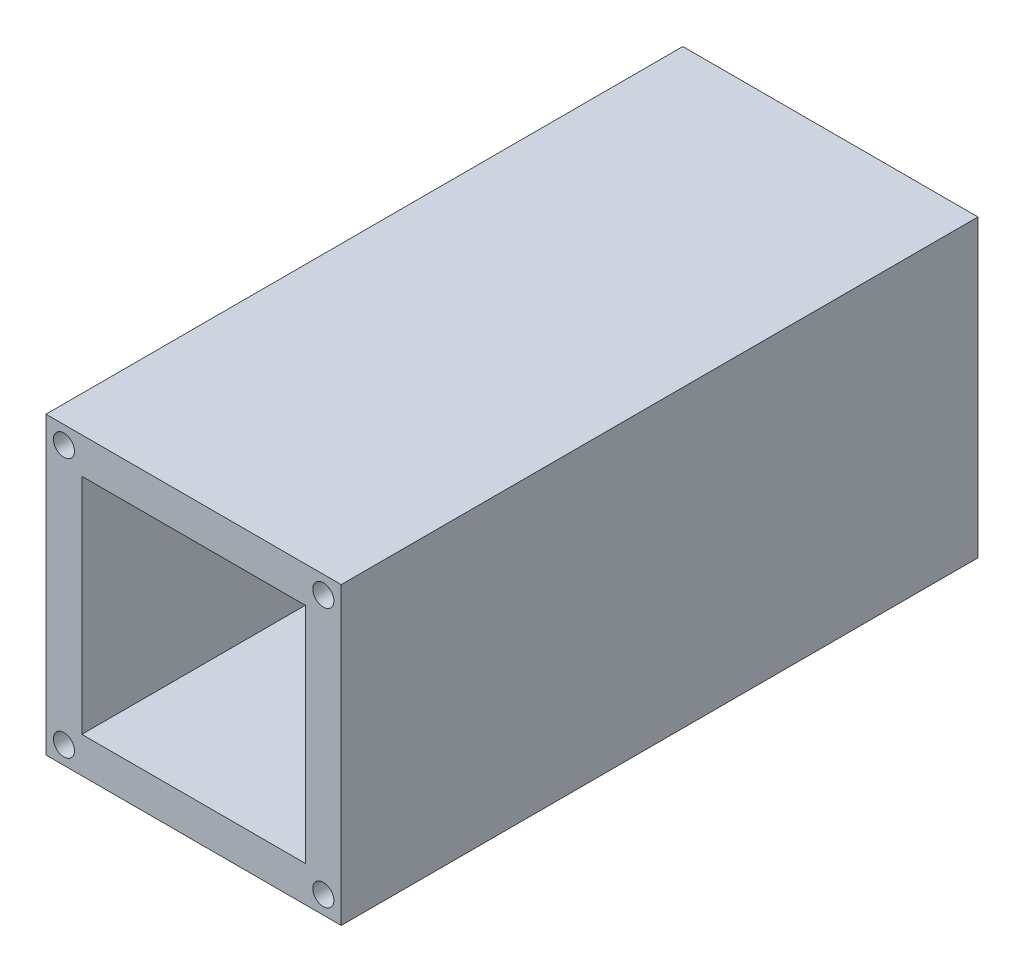
ISO-10303-21;
HEADER;
FILE_DESCRIPTION(('STEP AP214'),'2;1');
FILE_NAME('part.step','',(''),(''),'','','');
FILE_SCHEMA(('AUTOMOTIVE_DESIGN { 1 0 10303 214 1 1 1 1 }'));
ENDSEC;
DATA;
#1=APPLICATION_CONTEXT('core data for automotive mechanical design processes');
#2=APPLICATION_PROTOCOL_DEFINITION('international standard','automotive_design',2000,#1);
#3=PRODUCT_CONTEXT('',#1,'mechanical');
#4=PRODUCT('Part','Part','',(#3));
#5=PRODUCT_RELATED_PRODUCT_CATEGORY('part','',(#4));
#6=PRODUCT_DEFINITION_FORMATION('','',#4);
#7=PRODUCT_DEFINITION_CONTEXT('part definition',#1,'design');
#8=PRODUCT_DEFINITION('design','',#6,#7);
#9=PRODUCT_DEFINITION_SHAPE('','',#8);
#10=(LENGTH_UNIT() NAMED_UNIT(*) SI_UNIT(.MILLI.,.METRE.));
#11=(NAMED_UNIT(*) PLANE_ANGLE_UNIT() SI_UNIT($,.RADIAN.));
#12=(NAMED_UNIT(*) SI_UNIT($,.STERADIAN.) SOLID_ANGLE_UNIT());
#13=UNCERTAINTY_MEASURE_WITH_UNIT(LENGTH_MEASURE(1.E-05),#10,'distance_accuracy_value','');
#14=(GEOMETRIC_REPRESENTATION_CONTEXT(3) GLOBAL_UNCERTAINTY_ASSIGNED_CONTEXT((#13)) GLOBAL_UNIT_ASSIGNED_CONTEXT((#10,
#11,#12)) REPRESENTATION_CONTEXT('',''));
#15=CARTESIAN_POINT('',(0.,0.,0.));
#16=DIRECTION('',(0.,0.,1.));
#17=DIRECTION('',(1.,0.,0.));
#18=AXIS2_PLACEMENT_3D('',#15,#16,#17);
#19=CARTESIAN_POINT('',(13.25,5.,10.));
#20=DIRECTION('',(0.659692768975271,0.751535395415106,0.));
#21=DIRECTION('',(-0.751535395415106,0.659692768975271,0.));
#22=AXIS2_PLACEMENT_3D('',#19,#20,#21);
#23=PLANE('',#22);
#24=DIRECTION('',(-0.751535395415106,0.659692768975271,0.));
#25=VECTOR('',#24,1.);
#26=CARTESIAN_POINT('',(13.25,5.,30.));
#27=LINE('',#26,#25);
#28=CARTESIAN_POINT('',(13.25,5.,30.));
#29=VERTEX_POINT('',#28);
#30=CARTESIAN_POINT('',(8.38552563578441,9.27000322608372,30.));
#31=VERTEX_POINT('',#30);
#32=EDGE_CURVE('E212',#29,#31,#27,.T.);
#33=ORIENTED_EDGE('',*,*,#32,.F.);
#34=DIRECTION('',(0.,0.,1.));
#35=VECTOR('',#34,1.);
#36=CARTESIAN_POINT('',(13.25,5.,10.));
#37=LINE('',#36,#35);
#38=CARTESIAN_POINT('',(13.25,5.,37.));
#39=VERTEX_POINT('',#38);
#40=EDGE_CURVE('E236',#29,#39,#37,.T.);
#41=ORIENTED_EDGE('',*,*,#40,.T.);
#42=DIRECTION('',(-0.751535395415106,0.659692768975271,0.));
#43=VECTOR('',#42,1.);
#44=CARTESIAN_POINT('',(13.25,5.,37.));
#45=LINE('',#44,#43);
#46=CARTESIAN_POINT('',(8.38552563578441,9.27000322608372,37.));
#47=VERTEX_POINT('',#46);
#48=EDGE_CURVE('E219',#39,#47,#45,.T.);
#49=ORIENTED_EDGE('',*,*,#48,.T.);
#50=DIRECTION('',(0.,0.,1.));
#51=VECTOR('',#50,1.);
#52=CARTESIAN_POINT('',(8.38552563578441,9.27000322608372,10.));
#53=LINE('',#52,#51);
#54=EDGE_CURVE('E235',#31,#47,#53,.T.);
#55=ORIENTED_EDGE('',*,*,#54,.F.);
#56=EDGE_LOOP('',(#33,#41,#49,#55));
#57=FACE_BOUND('',#56,.T.);
#58=ADVANCED_FACE('F35',(#57),#23,.F.);
#59=CARTESIAN_POINT('',(13.25,-5.,10.));
#60=DIRECTION('',(0.659692768975271,-0.751535395415106,0.));
#61=DIRECTION('',(0.751535395415106,0.659692768975271,0.));
#62=AXIS2_PLACEMENT_3D('',#59,#60,#61);
#63=PLANE('',#62);
#64=DIRECTION('',(0.751535395415106,0.659692768975271,0.));
#65=VECTOR('',#64,1.);
#66=CARTESIAN_POINT('',(13.25,-5.,30.));
#67=LINE('',#66,#65);
#68=CARTESIAN_POINT('',(8.38552563578441,-9.27000322608372,30.));
#69=VERTEX_POINT('',#68);
#70=CARTESIAN_POINT('',(13.25,-5.,30.));
#71=VERTEX_POINT('',#70);
#72=EDGE_CURVE('E192',#69,#71,#67,.T.);
#73=ORIENTED_EDGE('',*,*,#72,.F.);
#74=DIRECTION('',(0.,0.,1.));
#75=VECTOR('',#74,1.);
#76=CARTESIAN_POINT('',(8.38552563578441,-9.27000322608372,10.));
#77=LINE('',#76,#75);
#78=CARTESIAN_POINT('',(8.38552563578441,-9.27000322608372,37.));
#79=VERTEX_POINT('',#78);
#80=EDGE_CURVE('E50',#69,#79,#77,.T.);
#81=ORIENTED_EDGE('',*,*,#80,.T.);
#82=DIRECTION('',(0.751535395415106,0.659692768975271,0.));
#83=VECTOR('',#82,1.);
#84=CARTESIAN_POINT('',(13.25,-5.,37.));
#85=LINE('',#84,#83);
#86=CARTESIAN_POINT('',(13.25,-5.,37.));
#87=VERTEX_POINT('',#86);
#88=EDGE_CURVE('E233',#79,#87,#85,.T.);
#89=ORIENTED_EDGE('',*,*,#88,.T.);
#90=DIRECTION('',(0.,0.,1.));
#91=VECTOR('',#90,1.);
#92=CARTESIAN_POINT('',(13.25,-5.,10.));
#93=LINE('',#92,#91);
#94=EDGE_CURVE('E238',#71,#87,#93,.T.);
#95=ORIENTED_EDGE('',*,*,#94,.F.);
#96=EDGE_LOOP('',(#73,#81,#89,#95));
#97=FACE_BOUND('',#96,.T.);
#98=ADVANCED_FACE('F385',(#97),#63,.F.);
#99=CARTESIAN_POINT('',(0.,0.282957820074073,10.));
#100=DIRECTION('',(0.,0.,1.));
#101=DIRECTION('',(1.,0.,0.));
#102=AXIS2_PLACEMENT_3D('',#99,#100,#101);
#103=CYLINDRICAL_SURFACE('',#102,12.711258983193);
#104=CARTESIAN_POINT('',(0.,0.282957820074073,30.));
#105=DIRECTION('',(0.,0.,-1.));
#106=DIRECTION('',(-1.,0.,0.));
#107=AXIS2_PLACEMENT_3D('',#104,#105,#106);
#108=CIRCLE('',#107,12.711258983193);
#109=CARTESIAN_POINT('',(-8.3855256357844,-9.27000322608372,30.));
#110=VERTEX_POINT('',#109);
#111=EDGE_CURVE('E216',#110,#69,#108,.F.);
#112=ORIENTED_EDGE('',*,*,#111,.F.);
#113=DIRECTION('',(0.,0.,1.));
#114=VECTOR('',#113,1.);
#115=CARTESIAN_POINT('',(-8.3855256357844,-9.27000322608372,10.));
#116=LINE('',#115,#114);
#117=CARTESIAN_POINT('',(-8.3855256357844,-9.27000322608372,37.));
#118=VERTEX_POINT('',#117);
#119=EDGE_CURVE('E241',#110,#118,#116,.T.);
#120=ORIENTED_EDGE('',*,*,#119,.T.);
#121=CARTESIAN_POINT('',(0.,0.282957820074073,37.));
#122=DIRECTION('',(0.,0.,1.));
#123=DIRECTION('',(-1.,0.,0.));
#124=AXIS2_PLACEMENT_3D('',#121,#122,#123);
#125=CIRCLE('',#124,12.711258983193);
#126=EDGE_CURVE('E231',#118,#79,#125,.T.);
#127=ORIENTED_EDGE('',*,*,#126,.T.);
#128=ORIENTED_EDGE('',*,*,#80,.F.);
#129=EDGE_LOOP('',(#112,#120,#127,#128));
#130=FACE_BOUND('',#129,.T.);
#131=ADVANCED_FACE('F389',(#130),#103,.F.);
#132=CARTESIAN_POINT('',(-13.25,-5.00000000000001,10.));
#133=DIRECTION('',(-0.659692768975271,-0.751535395415106,0.));
#134=DIRECTION('',(0.751535395415106,-0.659692768975271,0.));
#135=AXIS2_PLACEMENT_3D('',#132,#133,#134);
#136=PLANE('',#135);
#137=DIRECTION('',(0.751535395415106,-0.659692768975271,0.));
#138=VECTOR('',#137,1.);
#139=CARTESIAN_POINT('',(-13.25,-5.00000000000001,30.));
#140=LINE('',#139,#138);
#141=CARTESIAN_POINT('',(-13.25,-5.00000000000001,30.));
#142=VERTEX_POINT('',#141);
#143=EDGE_CURVE('E214',#142,#110,#140,.T.);
#144=ORIENTED_EDGE('',*,*,#143,.F.);
#145=DIRECTION('',(0.,0.,1.));
#146=VECTOR('',#145,1.);
#147=CARTESIAN_POINT('',(-13.25,-5.00000000000001,10.));
#148=LINE('',#147,#146);
#149=CARTESIAN_POINT('',(-13.25,-5.00000000000001,37.));
#150=VERTEX_POINT('',#149);
#151=EDGE_CURVE('E243',#142,#150,#148,.T.);
#152=ORIENTED_EDGE('',*,*,#151,.T.);
#153=DIRECTION('',(0.751535395415106,-0.659692768975271,0.));
#154=VECTOR('',#153,1.);
#155=CARTESIAN_POINT('',(-13.25,-5.00000000000001,37.));
#156=LINE('',#155,#154);
#157=EDGE_CURVE('E228',#150,#118,#156,.T.);
#158=ORIENTED_EDGE('',*,*,#157,.T.);
#159=ORIENTED_EDGE('',*,*,#119,.F.);
#160=EDGE_LOOP('',(#144,#152,#158,#159));
#161=FACE_BOUND('',#160,.T.);
#162=ADVANCED_FACE('F393',(#161),#136,.F.);
#163=CARTESIAN_POINT('',(-13.25,5.,10.));
#164=DIRECTION('',(-0.659692768975271,0.751535395415106,0.));
#165=DIRECTION('',(-0.751535395415106,-0.659692768975271,0.));
#166=AXIS2_PLACEMENT_3D('',#163,#164,#165);
#167=PLANE('',#166);
#168=DIRECTION('',(-0.751535395415106,-0.659692768975271,0.));
#169=VECTOR('',#168,1.);
#170=CARTESIAN_POINT('',(-13.25,5.,30.));
#171=LINE('',#170,#169);
#172=CARTESIAN_POINT('',(-8.3855256357844,9.27000322608372,30.));
#173=VERTEX_POINT('',#172);
#174=CARTESIAN_POINT('',(-13.25,5.,30.));
#175=VERTEX_POINT('',#174);
#176=EDGE_CURVE('E210',#173,#175,#171,.T.);
#177=ORIENTED_EDGE('',*,*,#176,.F.);
#178=DIRECTION('',(0.,0.,1.));
#179=VECTOR('',#178,1.);
#180=CARTESIAN_POINT('',(-8.38552563578441,9.27000322608372,10.));
#181=LINE('',#180,#179);
#182=CARTESIAN_POINT('',(-8.38552563578441,9.27000322608372,37.));
#183=VERTEX_POINT('',#182);
#184=EDGE_CURVE('E247',#173,#183,#181,.T.);
#185=ORIENTED_EDGE('',*,*,#184,.T.);
#186=DIRECTION('',(-0.751535395415106,-0.659692768975271,0.));
#187=VECTOR('',#186,1.);
#188=CARTESIAN_POINT('',(-13.25,5.,37.));
#189=LINE('',#188,#187);
#190=CARTESIAN_POINT('',(-13.25,5.,37.));
#191=VERTEX_POINT('',#190);
#192=EDGE_CURVE('E225',#183,#191,#189,.T.);
#193=ORIENTED_EDGE('',*,*,#192,.T.);
#194=DIRECTION('',(0.,0.,1.));
#195=VECTOR('',#194,1.);
#196=CARTESIAN_POINT('',(-13.25,5.,10.));
#197=LINE('',#196,#195);
#198=EDGE_CURVE('E245',#175,#191,#197,.T.);
#199=ORIENTED_EDGE('',*,*,#198,.F.);
#200=EDGE_LOOP('',(#177,#185,#193,#199));
#201=FACE_BOUND('',#200,.T.);
#202=ADVANCED_FACE('F358',(#201),#167,.F.);
#203=CARTESIAN_POINT('',(0.,-0.282957820074094,10.));
#204=DIRECTION('',(0.,0.,1.));
#205=DIRECTION('',(1.,0.,0.));
#206=AXIS2_PLACEMENT_3D('',#203,#204,#205);
#207=CYLINDRICAL_SURFACE('',#206,12.7112589831931);
#208=CARTESIAN_POINT('',(0.,-0.282957820074094,30.));
#209=DIRECTION('',(0.,0.,-1.));
#210=DIRECTION('',(-1.,0.,0.));
#211=AXIS2_PLACEMENT_3D('',#208,#209,#210);
#212=CIRCLE('',#211,12.7112589831931);
#213=EDGE_CURVE('E11',#31,#173,#212,.F.);
#214=ORIENTED_EDGE('',*,*,#213,.F.);
#215=ORIENTED_EDGE('',*,*,#54,.T.);
#216=CARTESIAN_POINT('',(0.,-0.282957820074094,37.));
#217=DIRECTION('',(0.,0.,1.));
#218=DIRECTION('',(-1.,0.,0.));
#219=AXIS2_PLACEMENT_3D('',#216,#217,#218);
#220=CIRCLE('',#219,12.7112589831931);
#221=EDGE_CURVE('E222',#47,#183,#220,.T.);
#222=ORIENTED_EDGE('',*,*,#221,.T.);
#223=ORIENTED_EDGE('',*,*,#184,.F.);
#224=EDGE_LOOP('',(#214,#215,#222,#223));
#225=FACE_BOUND('',#224,.T.);
#226=ADVANCED_FACE('F400',(#225),#207,.F.);
#227=CARTESIAN_POINT('',(0.,0.,37.));
#228=DIRECTION('',(0.,0.,1.));
#229=DIRECTION('',(1.,0.,0.));
#230=AXIS2_PLACEMENT_3D('',#227,#228,#229);
#231=PLANE('',#230);
#232=ORIENTED_EDGE('',*,*,#48,.F.);
#233=DIRECTION('',(0.,1.,0.));
#234=VECTOR('',#233,1.);
#235=CARTESIAN_POINT('',(13.25,-13.25,37.));
#236=LINE('',#235,#234);
#237=CARTESIAN_POINT('',(13.25,13.25,37.));
#238=VERTEX_POINT('',#237);
#239=EDGE_CURVE('E255',#39,#238,#236,.T.);
#240=ORIENTED_EDGE('',*,*,#239,.T.);
#241=DIRECTION('',(-1.,0.,0.));
#242=VECTOR('',#241,1.);
#243=CARTESIAN_POINT('',(13.25,13.25,37.));
#244=LINE('',#243,#242);
#245=CARTESIAN_POINT('',(-13.25,13.25,37.));
#246=VERTEX_POINT('',#245);
#247=EDGE_CURVE('E259',#238,#246,#244,.T.);
#248=ORIENTED_EDGE('',*,*,#247,.T.);
#249=DIRECTION('',(0.,-1.,0.));
#250=VECTOR('',#249,1.);
#251=CARTESIAN_POINT('',(-13.25,-13.25,37.));
#252=LINE('',#251,#250);
#253=EDGE_CURVE('E250',#246,#191,#252,.T.);
#254=ORIENTED_EDGE('',*,*,#253,.T.);
#255=ORIENTED_EDGE('',*,*,#192,.F.);
#256=ORIENTED_EDGE('',*,*,#221,.F.);
#257=EDGE_LOOP('',(#232,#240,#248,#254,#255,#256));
#258=FACE_BOUND('',#257,.T.);
#259=ADVANCED_FACE('F364',(#258),#231,.T.);
#260=CARTESIAN_POINT('',(13.25,13.25,-4.5));
#261=DIRECTION('',(0.,1.,0.));
#262=DIRECTION('',(-1.,0.,0.));
#263=AXIS2_PLACEMENT_3D('',#260,#261,#262);
#264=PLANE('',#263);
#265=DIRECTION('',(0.,0.,1.));
#266=VECTOR('',#265,1.);
#267=CARTESIAN_POINT('',(13.25,13.25,-4.5));
#268=LINE('',#267,#266);
#269=CARTESIAN_POINT('',(13.25,13.25,0.));
#270=VERTEX_POINT('',#269);
#271=CARTESIAN_POINT('',(13.25,13.25,30.));
#272=VERTEX_POINT('',#271);
#273=EDGE_CURVE('E302',#270,#272,#268,.T.);
#274=ORIENTED_EDGE('',*,*,#273,.T.);
#275=DIRECTION('',(1.,0.,0.));
#276=VECTOR('',#275,1.);
#277=CARTESIAN_POINT('',(-13.25,13.25,30.));
#278=LINE('',#277,#276);
#279=CARTESIAN_POINT('',(-13.25,13.25,30.));
#280=VERTEX_POINT('',#279);
#281=EDGE_CURVE('E207',#280,#272,#278,.T.);
#282=ORIENTED_EDGE('',*,*,#281,.F.);
#283=DIRECTION('',(0.,0.,1.));
#284=VECTOR('',#283,1.);
#285=CARTESIAN_POINT('',(-13.25,13.25,-4.5));
#286=LINE('',#285,#284);
#287=CARTESIAN_POINT('',(-13.25,13.25,0.));
#288=VERTEX_POINT('',#287);
#289=EDGE_CURVE('E298',#288,#280,#286,.T.);
#290=ORIENTED_EDGE('',*,*,#289,.F.);
#291=DIRECTION('',(-1.,0.,0.));
#292=VECTOR('',#291,1.);
#293=CARTESIAN_POINT('',(0.,13.25,0.));
#294=LINE('',#293,#292);
#295=EDGE_CURVE('E337',#270,#288,#294,.T.);
#296=ORIENTED_EDGE('',*,*,#295,.F.);
#297=EDGE_LOOP('',(#274,#282,#290,#296));
#298=FACE_BOUND('',#297,.T.);
#299=ADVANCED_FACE('F349',(#298),#264,.F.);
#300=CARTESIAN_POINT('',(13.25,-13.25,-4.5));
#301=DIRECTION('',(0.,-1.,0.));
#302=DIRECTION('',(1.,0.,0.));
#303=AXIS2_PLACEMENT_3D('',#300,#301,#302);
#304=PLANE('',#303);
#305=DIRECTION('',(0.,0.,1.));
#306=VECTOR('',#305,1.);
#307=CARTESIAN_POINT('',(-13.25,-13.25,-4.5));
#308=LINE('',#307,#306);
#309=CARTESIAN_POINT('',(-13.25,-13.25,0.));
#310=VERTEX_POINT('',#309);
#311=CARTESIAN_POINT('',(-13.25,-13.25,30.));
#312=VERTEX_POINT('',#311);
#313=EDGE_CURVE('E198',#310,#312,#308,.T.);
#314=ORIENTED_EDGE('',*,*,#313,.T.);
#315=DIRECTION('',(-1.,0.,0.));
#316=VECTOR('',#315,1.);
#317=CARTESIAN_POINT('',(-13.25,-13.25,30.));
#318=LINE('',#317,#316);
#319=CARTESIAN_POINT('',(13.25,-13.25,30.));
#320=VERTEX_POINT('',#319);
#321=EDGE_CURVE('E191',#320,#312,#318,.T.);
#322=ORIENTED_EDGE('',*,*,#321,.F.);
#323=DIRECTION('',(0.,0.,1.));
#324=VECTOR('',#323,1.);
#325=CARTESIAN_POINT('',(13.25,-13.25,-4.5));
#326=LINE('',#325,#324);
#327=CARTESIAN_POINT('',(13.25,-13.25,0.));
#328=VERTEX_POINT('',#327);
#329=EDGE_CURVE('E174',#328,#320,#326,.T.);
#330=ORIENTED_EDGE('',*,*,#329,.F.);
#331=DIRECTION('',(1.,0.,0.));
#332=VECTOR('',#331,1.);
#333=CARTESIAN_POINT('',(0.,-13.25,0.));
#334=LINE('',#333,#332);
#335=EDGE_CURVE('E334',#310,#328,#334,.T.);
#336=ORIENTED_EDGE('',*,*,#335,.F.);
#337=EDGE_LOOP('',(#314,#322,#330,#336));
#338=FACE_BOUND('',#337,.T.);
#339=ADVANCED_FACE('F196',(#338),#304,.F.);
#340=CARTESIAN_POINT('',(-17.5,-17.5,75.5));
#341=DIRECTION('',(1.,0.,0.));
#342=DIRECTION('',(0.,0.,-1.));
#343=AXIS2_PLACEMENT_3D('',#340,#341,#342);
#344=PLANE('',#343);
#345=DIRECTION('',(0.,-1.,0.));
#346=VECTOR('',#345,1.);
#347=CARTESIAN_POINT('',(-17.5,-17.5,0.));
#348=LINE('',#347,#346);
#349=CARTESIAN_POINT('',(-17.5,17.5,0.));
#350=VERTEX_POINT('',#349);
#351=CARTESIAN_POINT('',(-17.5,-17.5,0.));
#352=VERTEX_POINT('',#351);
#353=EDGE_CURVE('E300',#350,#352,#348,.T.);
#354=ORIENTED_EDGE('',*,*,#353,.T.);
#355=DIRECTION('',(0.,0.,-1.));
#356=VECTOR('',#355,1.);
#357=CARTESIAN_POINT('',(-17.5,-17.5,75.5));
#358=LINE('',#357,#356);
#359=CARTESIAN_POINT('',(-17.5,-17.5,75.5));
#360=VERTEX_POINT('',#359);
#361=EDGE_CURVE('E331',#360,#352,#358,.T.);
#362=ORIENTED_EDGE('',*,*,#361,.F.);
#363=DIRECTION('',(0.,-1.,0.));
#364=VECTOR('',#363,1.);
#365=CARTESIAN_POINT('',(-17.5,-17.5,75.5));
#366=LINE('',#365,#364);
#367=CARTESIAN_POINT('',(-17.5,17.5,75.5));
#368=VERTEX_POINT('',#367);
#369=EDGE_CURVE('E305',#368,#360,#366,.T.);
#370=ORIENTED_EDGE('',*,*,#369,.F.);
#371=DIRECTION('',(0.,0.,-1.));
#372=VECTOR('',#371,1.);
#373=CARTESIAN_POINT('',(-17.5,17.5,75.5));
#374=LINE('',#373,#372);
#375=EDGE_CURVE('E315',#368,#350,#374,.T.);
#376=ORIENTED_EDGE('',*,*,#375,.T.);
#377=EDGE_LOOP('',(#354,#362,#370,#376));
#378=FACE_BOUND('',#377,.T.);
#379=ADVANCED_FACE('F37',(#378),#344,.F.);
#380=CARTESIAN_POINT('',(17.5,-17.5,75.5));
#381=DIRECTION('',(0.,1.,0.));
#382=DIRECTION('',(-1.,0.,0.));
#383=AXIS2_PLACEMENT_3D('',#380,#381,#382);
#384=PLANE('',#383);
#385=DIRECTION('',(1.,0.,0.));
#386=VECTOR('',#385,1.);
#387=CARTESIAN_POINT('',(17.5,-17.5,0.));
#388=LINE('',#387,#386);
#389=CARTESIAN_POINT('',(17.5,-17.5,0.));
#390=VERTEX_POINT('',#389);
#391=EDGE_CURVE('E318',#352,#390,#388,.T.);
#392=ORIENTED_EDGE('',*,*,#391,.T.);
#393=DIRECTION('',(0.,0.,-1.));
#394=VECTOR('',#393,1.);
#395=CARTESIAN_POINT('',(17.5,-17.5,75.5));
#396=LINE('',#395,#394);
#397=CARTESIAN_POINT('',(17.5,-17.5,75.5));
#398=VERTEX_POINT('',#397);
#399=EDGE_CURVE('E328',#398,#390,#396,.T.);
#400=ORIENTED_EDGE('',*,*,#399,.F.);
#401=DIRECTION('',(1.,0.,0.));
#402=VECTOR('',#401,1.);
#403=CARTESIAN_POINT('',(17.5,-17.5,75.5));
#404=LINE('',#403,#402);
#405=EDGE_CURVE('E308',#360,#398,#404,.T.);
#406=ORIENTED_EDGE('',*,*,#405,.F.);
#407=ORIENTED_EDGE('',*,*,#361,.T.);
#408=EDGE_LOOP('',(#392,#400,#406,#407));
#409=FACE_BOUND('',#408,.T.);
#410=ADVANCED_FACE('F466',(#409),#384,.F.);
#411=CARTESIAN_POINT('',(17.5,-17.5,75.5));
#412=DIRECTION('',(-1.,0.,0.));
#413=DIRECTION('',(0.,-1.,0.));
#414=AXIS2_PLACEMENT_3D('',#411,#412,#413);
#415=PLANE('',#414);
#416=DIRECTION('',(0.,1.,0.));
#417=VECTOR('',#416,1.);
#418=CARTESIAN_POINT('',(17.5,-17.5,0.));
#419=LINE('',#418,#417);
#420=CARTESIAN_POINT('',(17.5,17.5,0.));
#421=VERTEX_POINT('',#420);
#422=EDGE_CURVE('E320',#390,#421,#419,.T.);
#423=ORIENTED_EDGE('',*,*,#422,.T.);
#424=DIRECTION('',(0.,0.,-1.));
#425=VECTOR('',#424,1.);
#426=CARTESIAN_POINT('',(17.5,17.5,75.5));
#427=LINE('',#426,#425);
#428=CARTESIAN_POINT('',(17.5,17.5,75.5));
#429=VERTEX_POINT('',#428);
#430=EDGE_CURVE('E325',#429,#421,#427,.T.);
#431=ORIENTED_EDGE('',*,*,#430,.F.);
#432=DIRECTION('',(0.,1.,0.));
#433=VECTOR('',#432,1.);
#434=CARTESIAN_POINT('',(17.5,-17.5,75.5));
#435=LINE('',#434,#433);
#436=EDGE_CURVE('E311',#398,#429,#435,.T.);
#437=ORIENTED_EDGE('',*,*,#436,.F.);
#438=ORIENTED_EDGE('',*,*,#399,.T.);
#439=EDGE_LOOP('',(#423,#431,#437,#438));
#440=FACE_BOUND('',#439,.T.);
#441=ADVANCED_FACE('F463',(#440),#415,.F.);
#442=CARTESIAN_POINT('',(17.5,17.5,75.5));
#443=DIRECTION('',(0.,-1.,0.));
#444=DIRECTION('',(1.,0.,0.));
#445=AXIS2_PLACEMENT_3D('',#442,#443,#444);
#446=PLANE('',#445);
#447=DIRECTION('',(-1.,0.,0.));
#448=VECTOR('',#447,1.);
#449=CARTESIAN_POINT('',(17.5,17.5,0.));
#450=LINE('',#449,#448);
#451=EDGE_CURVE('E309',#421,#350,#450,.T.);
#452=ORIENTED_EDGE('',*,*,#451,.T.);
#453=ORIENTED_EDGE('',*,*,#375,.F.);
#454=DIRECTION('',(-1.,0.,0.));
#455=VECTOR('',#454,1.);
#456=CARTESIAN_POINT('',(17.5,17.5,75.5));
#457=LINE('',#456,#455);
#458=EDGE_CURVE('E313',#429,#368,#457,.T.);
#459=ORIENTED_EDGE('',*,*,#458,.F.);
#460=ORIENTED_EDGE('',*,*,#430,.T.);
#461=EDGE_LOOP('',(#452,#453,#459,#460));
#462=FACE_BOUND('',#461,.T.);
#463=ADVANCED_FACE('F456',(#462),#446,.F.);
#464=CARTESIAN_POINT('',(0.,0.,75.5));
#465=DIRECTION('',(0.,0.,1.));
#466=DIRECTION('',(1.,0.,0.));
#467=AXIS2_PLACEMENT_3D('',#464,#465,#466);
#468=PLANE('',#467);
#469=CARTESIAN_POINT('',(-15.375,-15.38,75.5));
#470=DIRECTION('',(0.,0.,1.));
#471=DIRECTION('',(1.,0.,0.));
#472=AXIS2_PLACEMENT_3D('',#469,#470,#471);
#473=CIRCLE('',#472,1.25);
#474=CARTESIAN_POINT('',(-14.125,-15.38,75.5));
#475=VERTEX_POINT('',#474);
#476=EDGE_CURVE('E261',#475,#475,#473,.T.);
#477=ORIENTED_EDGE('',*,*,#476,.F.);
#478=EDGE_LOOP('',(#477));
#479=FACE_BOUND('',#478,.T.);
#480=CARTESIAN_POINT('',(15.38,-15.38,75.5));
#481=DIRECTION('',(0.,0.,1.));
#482=DIRECTION('',(1.,0.,0.));
#483=AXIS2_PLACEMENT_3D('',#480,#481,#482);
#484=CIRCLE('',#483,1.25);
#485=CARTESIAN_POINT('',(16.63,-15.38,75.5));
#486=VERTEX_POINT('',#485);
#487=EDGE_CURVE('E272',#486,#486,#484,.T.);
#488=ORIENTED_EDGE('',*,*,#487,.F.);
#489=EDGE_LOOP('',(#488));
#490=FACE_BOUND('',#489,.T.);
#491=CARTESIAN_POINT('',(15.38,15.38,75.5));
#492=DIRECTION('',(0.,0.,1.));
#493=DIRECTION('',(1.,0.,0.));
#494=AXIS2_PLACEMENT_3D('',#491,#492,#493);
#495=CIRCLE('',#494,1.25);
#496=CARTESIAN_POINT('',(16.63,15.38,75.5));
#497=VERTEX_POINT('',#496);
#498=EDGE_CURVE('E266',#497,#497,#495,.T.);
#499=ORIENTED_EDGE('',*,*,#498,.F.);
#500=EDGE_LOOP('',(#499));
#501=FACE_BOUND('',#500,.T.);
#502=CARTESIAN_POINT('',(-15.375,15.38,75.5));
#503=DIRECTION('',(0.,0.,1.));
#504=DIRECTION('',(1.,0.,0.));
#505=AXIS2_PLACEMENT_3D('',#502,#503,#504);
#506=CIRCLE('',#505,1.25);
#507=CARTESIAN_POINT('',(-14.125,15.38,75.5));
#508=VERTEX_POINT('',#507);
#509=EDGE_CURVE('E265',#508,#508,#506,.T.);
#510=ORIENTED_EDGE('',*,*,#509,.F.);
#511=EDGE_LOOP('',(#510));
#512=FACE_BOUND('',#511,.T.);
#513=DIRECTION('',(0.,-1.,0.));
#514=VECTOR('',#513,1.);
#515=CARTESIAN_POINT('',(-13.25,-13.25,75.5));
#516=LINE('',#515,#514);
#517=CARTESIAN_POINT('',(-13.25,13.25,75.5));
#518=VERTEX_POINT('',#517);
#519=CARTESIAN_POINT('',(-13.25,-13.25,75.5));
#520=VERTEX_POINT('',#519);
#521=EDGE_CURVE('E283',#518,#520,#516,.T.);
#522=ORIENTED_EDGE('',*,*,#521,.F.);
#523=DIRECTION('',(-1.,0.,0.));
#524=VECTOR('',#523,1.);
#525=CARTESIAN_POINT('',(13.25,13.25,75.5));
#526=LINE('',#525,#524);
#527=CARTESIAN_POINT('',(13.25,13.25,75.5));
#528=VERTEX_POINT('',#527);
#529=EDGE_CURVE('E294',#528,#518,#526,.T.);
#530=ORIENTED_EDGE('',*,*,#529,.F.);
#531=DIRECTION('',(0.,1.,0.));
#532=VECTOR('',#531,1.);
#533=CARTESIAN_POINT('',(13.25,-13.25,75.5));
#534=LINE('',#533,#532);
#535=CARTESIAN_POINT('',(13.25,-13.25,75.5));
#536=VERTEX_POINT('',#535);
#537=EDGE_CURVE('E291',#536,#528,#534,.T.);
#538=ORIENTED_EDGE('',*,*,#537,.F.);
#539=DIRECTION('',(1.,0.,0.));
#540=VECTOR('',#539,1.);
#541=CARTESIAN_POINT('',(13.25,-13.25,75.5));
#542=LINE('',#541,#540);
#543=EDGE_CURVE('E288',#520,#536,#542,.T.);
#544=ORIENTED_EDGE('',*,*,#543,.F.);
#545=EDGE_LOOP('',(#522,#530,#538,#544));
#546=FACE_BOUND('',#545,.T.);
#547=ORIENTED_EDGE('',*,*,#369,.T.);
#548=ORIENTED_EDGE('',*,*,#405,.T.);
#549=ORIENTED_EDGE('',*,*,#436,.T.);
#550=ORIENTED_EDGE('',*,*,#458,.T.);
#551=EDGE_LOOP('',(#547,#548,#549,#550));
#552=FACE_BOUND('',#551,.T.);
#553=ADVANCED_FACE('F375',(#479,#490,#501,#512,#546,#552),#468,.T.);
#554=CARTESIAN_POINT('',(0.,0.,0.));
#555=DIRECTION('',(0.,0.,1.));
#556=DIRECTION('',(1.,0.,0.));
#557=AXIS2_PLACEMENT_3D('',#554,#555,#556);
#558=PLANE('',#557);
#559=CARTESIAN_POINT('',(15.38,-15.38,0.));
#560=DIRECTION('',(0.,0.,-1.));
#561=DIRECTION('',(-1.,0.,0.));
#562=AXIS2_PLACEMENT_3D('',#559,#560,#561);
#563=CIRCLE('',#562,1.25);
#564=CARTESIAN_POINT('',(14.13,-15.38,0.));
#565=VERTEX_POINT('',#564);
#566=EDGE_CURVE('E751',#565,#565,#563,.T.);
#567=ORIENTED_EDGE('',*,*,#566,.F.);
#568=EDGE_LOOP('',(#567));
#569=FACE_BOUND('',#568,.T.);
#570=CARTESIAN_POINT('',(-15.38,-15.38,0.));
#571=DIRECTION('',(0.,0.,-1.));
#572=DIRECTION('',(-1.,0.,0.));
#573=AXIS2_PLACEMENT_3D('',#570,#571,#572);
#574=CIRCLE('',#573,1.25);
#575=CARTESIAN_POINT('',(-16.63,-15.38,0.));
#576=VERTEX_POINT('',#575);
#577=EDGE_CURVE('E750',#576,#576,#574,.T.);
#578=ORIENTED_EDGE('',*,*,#577,.F.);
#579=EDGE_LOOP('',(#578));
#580=FACE_BOUND('',#579,.T.);
#581=CARTESIAN_POINT('',(-15.38,15.38,0.));
#582=DIRECTION('',(0.,0.,-1.));
#583=DIRECTION('',(-1.,0.,0.));
#584=AXIS2_PLACEMENT_3D('',#581,#582,#583);
#585=CIRCLE('',#584,1.25);
#586=CARTESIAN_POINT('',(-16.63,15.38,0.));
#587=VERTEX_POINT('',#586);
#588=EDGE_CURVE('E767',#587,#587,#585,.T.);
#589=ORIENTED_EDGE('',*,*,#588,.F.);
#590=EDGE_LOOP('',(#589));
#591=FACE_BOUND('',#590,.T.);
#592=CARTESIAN_POINT('',(15.38,15.38,0.));
#593=DIRECTION('',(0.,0.,-1.));
#594=DIRECTION('',(-1.,0.,0.));
#595=AXIS2_PLACEMENT_3D('',#592,#593,#594);
#596=CIRCLE('',#595,1.25);
#597=CARTESIAN_POINT('',(14.13,15.38,0.));
#598=VERTEX_POINT('',#597);
#599=EDGE_CURVE('E761',#598,#598,#596,.T.);
#600=ORIENTED_EDGE('',*,*,#599,.F.);
#601=EDGE_LOOP('',(#600));
#602=FACE_BOUND('',#601,.T.);
#603=ORIENTED_EDGE('',*,*,#295,.T.);
#604=DIRECTION('',(0.,-1.,0.));
#605=VECTOR('',#604,1.);
#606=CARTESIAN_POINT('',(-13.25,0.,0.));
#607=LINE('',#606,#605);
#608=EDGE_CURVE('E43',#288,#310,#607,.T.);
#609=ORIENTED_EDGE('',*,*,#608,.T.);
#610=ORIENTED_EDGE('',*,*,#335,.T.);
#611=DIRECTION('',(0.,1.,0.));
#612=VECTOR('',#611,1.);
#613=CARTESIAN_POINT('',(13.25,0.,0.));
#614=LINE('',#613,#612);
#615=EDGE_CURVE('E181',#328,#270,#614,.T.);
#616=ORIENTED_EDGE('',*,*,#615,.T.);
#617=EDGE_LOOP('',(#603,#609,#610,#616));
#618=FACE_BOUND('',#617,.T.);
#619=ORIENTED_EDGE('',*,*,#353,.F.);
#620=ORIENTED_EDGE('',*,*,#451,.F.);
#621=ORIENTED_EDGE('',*,*,#422,.F.);
#622=ORIENTED_EDGE('',*,*,#391,.F.);
#623=EDGE_LOOP('',(#619,#620,#621,#622));
#624=FACE_BOUND('',#623,.T.);
#625=ADVANCED_FACE('F341',(#569,#580,#591,#602,#618,#624),#558,.F.);
#626=CARTESIAN_POINT('',(-13.25,-13.25,-4.5));
#627=DIRECTION('',(-1.,0.,0.));
#628=DIRECTION('',(0.,0.,1.));
#629=AXIS2_PLACEMENT_3D('',#626,#627,#628);
#630=PLANE('',#629);
#631=DIRECTION('',(0.,1.,0.));
#632=VECTOR('',#631,1.);
#633=CARTESIAN_POINT('',(-13.25,-13.25,30.));
#634=LINE('',#633,#632);
#635=EDGE_CURVE('E200',#175,#280,#634,.T.);
#636=ORIENTED_EDGE('',*,*,#635,.F.);
#637=ORIENTED_EDGE('',*,*,#198,.T.);
#638=ORIENTED_EDGE('',*,*,#253,.F.);
#639=EDGE_CURVE('E301',#246,#518,#286,.T.);
#640=ORIENTED_EDGE('',*,*,#639,.T.);
#641=ORIENTED_EDGE('',*,*,#521,.T.);
#642=CARTESIAN_POINT('',(-13.25,-13.25,37.));
#643=VERTEX_POINT('',#642);
#644=EDGE_CURVE('E297',#643,#520,#308,.T.);
#645=ORIENTED_EDGE('',*,*,#644,.F.);
#646=EDGE_CURVE('E58',#150,#643,#252,.T.);
#647=ORIENTED_EDGE('',*,*,#646,.F.);
#648=ORIENTED_EDGE('',*,*,#151,.F.);
#649=EDGE_CURVE('E203',#312,#142,#634,.T.);
#650=ORIENTED_EDGE('',*,*,#649,.F.);
#651=ORIENTED_EDGE('',*,*,#313,.F.);
#652=ORIENTED_EDGE('',*,*,#608,.F.);
#653=ORIENTED_EDGE('',*,*,#289,.T.);
#654=EDGE_LOOP('',(#636,#637,#638,#640,#641,#645,#647,#648,#650,#651,#652,#653));
#655=FACE_BOUND('',#654,.T.);
#656=ADVANCED_FACE('F346',(#655),#630,.F.);
#657=ORIENTED_EDGE('',*,*,#639,.F.);
#658=ORIENTED_EDGE('',*,*,#247,.F.);
#659=EDGE_CURVE('E185',#238,#528,#268,.T.);
#660=ORIENTED_EDGE('',*,*,#659,.T.);
#661=ORIENTED_EDGE('',*,*,#529,.T.);
#662=EDGE_LOOP('',(#657,#658,#660,#661));
#663=FACE_BOUND('',#662,.T.);
#664=ADVANCED_FACE('F368',(#663),#264,.F.);
#665=CARTESIAN_POINT('',(13.25,-13.25,-4.5));
#666=DIRECTION('',(1.,0.,0.));
#667=DIRECTION('',(0.,0.,-1.));
#668=AXIS2_PLACEMENT_3D('',#665,#666,#667);
#669=PLANE('',#668);
#670=DIRECTION('',(0.,-1.,0.));
#671=VECTOR('',#670,1.);
#672=CARTESIAN_POINT('',(13.25,-13.25,30.));
#673=LINE('',#672,#671);
#674=EDGE_CURVE('E177',#71,#320,#673,.T.);
#675=ORIENTED_EDGE('',*,*,#674,.F.);
#676=ORIENTED_EDGE('',*,*,#94,.T.);
#677=CARTESIAN_POINT('',(13.25,-13.25,37.));
#678=VERTEX_POINT('',#677);
#679=EDGE_CURVE('E256',#678,#87,#236,.T.);
#680=ORIENTED_EDGE('',*,*,#679,.F.);
#681=EDGE_CURVE('E186',#678,#536,#326,.T.);
#682=ORIENTED_EDGE('',*,*,#681,.T.);
#683=ORIENTED_EDGE('',*,*,#537,.T.);
#684=ORIENTED_EDGE('',*,*,#659,.F.);
#685=ORIENTED_EDGE('',*,*,#239,.F.);
#686=ORIENTED_EDGE('',*,*,#40,.F.);
#687=EDGE_CURVE('E193',#272,#29,#673,.T.);
#688=ORIENTED_EDGE('',*,*,#687,.F.);
#689=ORIENTED_EDGE('',*,*,#273,.F.);
#690=ORIENTED_EDGE('',*,*,#615,.F.);
#691=ORIENTED_EDGE('',*,*,#329,.T.);
#692=EDGE_LOOP('',(#675,#676,#680,#682,#683,#684,#685,#686,#688,#689,#690,#691));
#693=FACE_BOUND('',#692,.T.);
#694=ADVANCED_FACE('F176',(#693),#669,.F.);
#695=ORIENTED_EDGE('',*,*,#681,.F.);
#696=DIRECTION('',(1.,0.,0.));
#697=VECTOR('',#696,1.);
#698=CARTESIAN_POINT('',(13.25,-13.25,37.));
#699=LINE('',#698,#697);
#700=EDGE_CURVE('E253',#643,#678,#699,.T.);
#701=ORIENTED_EDGE('',*,*,#700,.F.);
#702=ORIENTED_EDGE('',*,*,#644,.T.);
#703=ORIENTED_EDGE('',*,*,#543,.T.);
#704=EDGE_LOOP('',(#695,#701,#702,#703));
#705=FACE_BOUND('',#704,.T.);
#706=ADVANCED_FACE('F381',(#705),#304,.F.);
#707=CARTESIAN_POINT('',(-15.375,15.38,65.5));
#708=DIRECTION('',(0.,0.,1.));
#709=DIRECTION('',(1.,0.,0.));
#710=AXIS2_PLACEMENT_3D('',#707,#708,#709);
#711=CYLINDRICAL_SURFACE('',#710,1.25);
#712=CARTESIAN_POINT('',(-15.375,15.38,65.5));
#713=DIRECTION('',(0.,0.,1.));
#714=DIRECTION('',(1.,0.,0.));
#715=AXIS2_PLACEMENT_3D('',#712,#713,#714);
#716=CIRCLE('',#715,1.25);
#717=CARTESIAN_POINT('',(-14.125,15.38,65.5));
#718=VERTEX_POINT('',#717);
#719=EDGE_CURVE('E280',#718,#718,#716,.T.);
#720=ORIENTED_EDGE('',*,*,#719,.F.);
#721=EDGE_LOOP('',(#720));
#722=FACE_BOUND('',#721,.T.);
#723=ORIENTED_EDGE('',*,*,#509,.T.);
#724=EDGE_LOOP('',(#723));
#725=FACE_BOUND('',#724,.T.);
#726=ADVANCED_FACE('F441',(#722,#725),#711,.F.);
#727=CARTESIAN_POINT('',(-15.375,15.38,65.5));
#728=DIRECTION('',(0.,0.,1.));
#729=DIRECTION('',(1.,0.,0.));
#730=AXIS2_PLACEMENT_3D('',#727,#728,#729);
#731=PLANE('',#730);
#732=ORIENTED_EDGE('',*,*,#719,.T.);
#733=EDGE_LOOP('',(#732));
#734=FACE_BOUND('',#733,.T.);
#735=ADVANCED_FACE('F423',(#734),#731,.T.);
#736=CARTESIAN_POINT('',(15.38,15.38,65.5));
#737=DIRECTION('',(0.,0.,1.));
#738=DIRECTION('',(1.,0.,0.));
#739=AXIS2_PLACEMENT_3D('',#736,#737,#738);
#740=CYLINDRICAL_SURFACE('',#739,1.25);
#741=CARTESIAN_POINT('',(15.38,15.38,65.5));
#742=DIRECTION('',(0.,0.,1.));
#743=DIRECTION('',(1.,0.,0.));
#744=AXIS2_PLACEMENT_3D('',#741,#742,#743);
#745=CIRCLE('',#744,1.25);
#746=CARTESIAN_POINT('',(16.63,15.38,65.5));
#747=VERTEX_POINT('',#746);
#748=EDGE_CURVE('E262',#747,#747,#745,.T.);
#749=ORIENTED_EDGE('',*,*,#748,.F.);
#750=EDGE_LOOP('',(#749));
#751=FACE_BOUND('',#750,.T.);
#752=ORIENTED_EDGE('',*,*,#498,.T.);
#753=EDGE_LOOP('',(#752));
#754=FACE_BOUND('',#753,.T.);
#755=ADVANCED_FACE('F419',(#751,#754),#740,.F.);
#756=CARTESIAN_POINT('',(15.38,15.38,65.5));
#757=DIRECTION('',(0.,0.,1.));
#758=DIRECTION('',(1.,0.,0.));
#759=AXIS2_PLACEMENT_3D('',#756,#757,#758);
#760=PLANE('',#759);
#761=ORIENTED_EDGE('',*,*,#748,.T.);
#762=EDGE_LOOP('',(#761));
#763=FACE_BOUND('',#762,.T.);
#764=ADVANCED_FACE('F415',(#763),#760,.T.);
#765=CARTESIAN_POINT('',(15.38,-15.38,65.5));
#766=DIRECTION('',(0.,0.,1.));
#767=DIRECTION('',(1.,0.,0.));
#768=AXIS2_PLACEMENT_3D('',#765,#766,#767);
#769=CYLINDRICAL_SURFACE('',#768,1.25);
#770=CARTESIAN_POINT('',(15.38,-15.38,65.5));
#771=DIRECTION('',(0.,0.,1.));
#772=DIRECTION('',(1.,0.,0.));
#773=AXIS2_PLACEMENT_3D('',#770,#771,#772);
#774=CIRCLE('',#773,1.25);
#775=CARTESIAN_POINT('',(16.63,-15.38,65.5));
#776=VERTEX_POINT('',#775);
#777=EDGE_CURVE('E269',#776,#776,#774,.T.);
#778=ORIENTED_EDGE('',*,*,#777,.F.);
#779=EDGE_LOOP('',(#778));
#780=FACE_BOUND('',#779,.T.);
#781=ORIENTED_EDGE('',*,*,#487,.T.);
#782=EDGE_LOOP('',(#781));
#783=FACE_BOUND('',#782,.T.);
#784=ADVANCED_FACE('F418',(#780,#783),#769,.F.);
#785=CARTESIAN_POINT('',(15.38,-15.38,65.5));
#786=DIRECTION('',(0.,0.,1.));
#787=DIRECTION('',(1.,0.,0.));
#788=AXIS2_PLACEMENT_3D('',#785,#786,#787);
#789=PLANE('',#788);
#790=ORIENTED_EDGE('',*,*,#777,.T.);
#791=EDGE_LOOP('',(#790));
#792=FACE_BOUND('',#791,.T.);
#793=ADVANCED_FACE('F425',(#792),#789,.T.);
#794=CARTESIAN_POINT('',(-15.375,-15.38,65.5));
#795=DIRECTION('',(0.,0.,1.));
#796=DIRECTION('',(1.,0.,0.));
#797=AXIS2_PLACEMENT_3D('',#794,#795,#796);
#798=CYLINDRICAL_SURFACE('',#797,1.25);
#799=CARTESIAN_POINT('',(-15.375,-15.38,65.5));
#800=DIRECTION('',(0.,0.,1.));
#801=DIRECTION('',(1.,0.,0.));
#802=AXIS2_PLACEMENT_3D('',#799,#800,#801);
#803=CIRCLE('',#802,1.25);
#804=CARTESIAN_POINT('',(-14.125,-15.38,65.5));
#805=VERTEX_POINT('',#804);
#806=EDGE_CURVE('E275',#805,#805,#803,.T.);
#807=ORIENTED_EDGE('',*,*,#806,.F.);
#808=EDGE_LOOP('',(#807));
#809=FACE_BOUND('',#808,.T.);
#810=ORIENTED_EDGE('',*,*,#476,.T.);
#811=EDGE_LOOP('',(#810));
#812=FACE_BOUND('',#811,.T.);
#813=ADVANCED_FACE('F428',(#809,#812),#798,.F.);
#814=CARTESIAN_POINT('',(-15.375,-15.38,65.5));
#815=DIRECTION('',(0.,0.,1.));
#816=DIRECTION('',(1.,0.,0.));
#817=AXIS2_PLACEMENT_3D('',#814,#815,#816);
#818=PLANE('',#817);
#819=ORIENTED_EDGE('',*,*,#806,.T.);
#820=EDGE_LOOP('',(#819));
#821=FACE_BOUND('',#820,.T.);
#822=ADVANCED_FACE('F414',(#821),#818,.T.);
#823=ORIENTED_EDGE('',*,*,#157,.F.);
#824=ORIENTED_EDGE('',*,*,#646,.T.);
#825=ORIENTED_EDGE('',*,*,#700,.T.);
#826=ORIENTED_EDGE('',*,*,#679,.T.);
#827=ORIENTED_EDGE('',*,*,#88,.F.);
#828=ORIENTED_EDGE('',*,*,#126,.F.);
#829=EDGE_LOOP('',(#823,#824,#825,#826,#827,#828));
#830=FACE_BOUND('',#829,.T.);
#831=ADVANCED_FACE('F383',(#830),#231,.T.);
#832=CARTESIAN_POINT('',(0.,0.,30.));
#833=DIRECTION('',(0.,0.,-1.));
#834=DIRECTION('',(-1.,0.,0.));
#835=AXIS2_PLACEMENT_3D('',#832,#833,#834);
#836=PLANE('',#835);
#837=ORIENTED_EDGE('',*,*,#72,.T.);
#838=ORIENTED_EDGE('',*,*,#674,.T.);
#839=ORIENTED_EDGE('',*,*,#321,.T.);
#840=ORIENTED_EDGE('',*,*,#649,.T.);
#841=ORIENTED_EDGE('',*,*,#143,.T.);
#842=ORIENTED_EDGE('',*,*,#111,.T.);
#843=EDGE_LOOP('',(#837,#838,#839,#840,#841,#842));
#844=FACE_BOUND('',#843,.T.);
#845=ADVANCED_FACE('F190',(#844),#836,.T.);
#846=ORIENTED_EDGE('',*,*,#32,.T.);
#847=ORIENTED_EDGE('',*,*,#213,.T.);
#848=ORIENTED_EDGE('',*,*,#176,.T.);
#849=ORIENTED_EDGE('',*,*,#635,.T.);
#850=ORIENTED_EDGE('',*,*,#281,.T.);
#851=ORIENTED_EDGE('',*,*,#687,.T.);
#852=EDGE_LOOP('',(#846,#847,#848,#849,#850,#851));
#853=FACE_BOUND('',#852,.T.);
#854=ADVANCED_FACE('F352',(#853),#836,.T.);
#855=CARTESIAN_POINT('',(15.38,15.38,10.));
#856=DIRECTION('',(0.,0.,-1.));
#857=DIRECTION('',(-1.,0.,0.));
#858=AXIS2_PLACEMENT_3D('',#855,#856,#857);
#859=CYLINDRICAL_SURFACE('',#858,1.25);
#860=CARTESIAN_POINT('',(15.38,15.38,10.));
#861=DIRECTION('',(0.,0.,-1.));
#862=DIRECTION('',(-1.,0.,0.));
#863=AXIS2_PLACEMENT_3D('',#860,#861,#862);
#864=CIRCLE('',#863,1.25);
#865=CARTESIAN_POINT('',(14.13,15.38,10.));
#866=VERTEX_POINT('',#865);
#867=EDGE_CURVE('E194',#866,#866,#864,.T.);
#868=ORIENTED_EDGE('',*,*,#867,.F.);
#869=EDGE_LOOP('',(#868));
#870=FACE_BOUND('',#869,.T.);
#871=ORIENTED_EDGE('',*,*,#599,.T.);
#872=EDGE_LOOP('',(#871));
#873=FACE_BOUND('',#872,.T.);
#874=ADVANCED_FACE('F665',(#870,#873),#859,.F.);
#875=CARTESIAN_POINT('',(15.38,15.38,10.));
#876=DIRECTION('',(0.,0.,-1.));
#877=DIRECTION('',(-1.,0.,0.));
#878=AXIS2_PLACEMENT_3D('',#875,#876,#877);
#879=PLANE('',#878);
#880=ORIENTED_EDGE('',*,*,#867,.T.);
#881=EDGE_LOOP('',(#880));
#882=FACE_BOUND('',#881,.T.);
#883=ADVANCED_FACE('F673',(#882),#879,.T.);
#884=CARTESIAN_POINT('',(-15.38,15.38,10.));
#885=DIRECTION('',(0.,0.,-1.));
#886=DIRECTION('',(-1.,0.,0.));
#887=AXIS2_PLACEMENT_3D('',#884,#885,#886);
#888=CYLINDRICAL_SURFACE('',#887,1.25);
#889=CARTESIAN_POINT('',(-15.38,15.38,10.));
#890=DIRECTION('',(0.,0.,-1.));
#891=DIRECTION('',(-1.,0.,0.));
#892=AXIS2_PLACEMENT_3D('',#889,#890,#891);
#893=CIRCLE('',#892,1.25);
#894=CARTESIAN_POINT('',(-16.63,15.38,10.));
#895=VERTEX_POINT('',#894);
#896=EDGE_CURVE('E763',#895,#895,#893,.T.);
#897=ORIENTED_EDGE('',*,*,#896,.F.);
#898=EDGE_LOOP('',(#897));
#899=FACE_BOUND('',#898,.T.);
#900=ORIENTED_EDGE('',*,*,#588,.T.);
#901=EDGE_LOOP('',(#900));
#902=FACE_BOUND('',#901,.T.);
#903=ADVANCED_FACE('F680',(#899,#902),#888,.F.);
#904=CARTESIAN_POINT('',(-15.38,15.38,10.));
#905=DIRECTION('',(0.,0.,-1.));
#906=DIRECTION('',(-1.,0.,0.));
#907=AXIS2_PLACEMENT_3D('',#904,#905,#906);
#908=PLANE('',#907);
#909=ORIENTED_EDGE('',*,*,#896,.T.);
#910=EDGE_LOOP('',(#909));
#911=FACE_BOUND('',#910,.T.);
#912=ADVANCED_FACE('F688',(#911),#908,.T.);
#913=CARTESIAN_POINT('',(-15.38,-15.38,10.));
#914=DIRECTION('',(0.,0.,-1.));
#915=DIRECTION('',(-1.,0.,0.));
#916=AXIS2_PLACEMENT_3D('',#913,#914,#915);
#917=CYLINDRICAL_SURFACE('',#916,1.25);
#918=CARTESIAN_POINT('',(-15.38,-15.38,10.));
#919=DIRECTION('',(0.,0.,-1.));
#920=DIRECTION('',(-1.,0.,0.));
#921=AXIS2_PLACEMENT_3D('',#918,#919,#920);
#922=CIRCLE('',#921,1.25);
#923=CARTESIAN_POINT('',(-16.63,-15.38,10.));
#924=VERTEX_POINT('',#923);
#925=EDGE_CURVE('E754',#924,#924,#922,.T.);
#926=ORIENTED_EDGE('',*,*,#925,.F.);
#927=EDGE_LOOP('',(#926));
#928=FACE_BOUND('',#927,.T.);
#929=ORIENTED_EDGE('',*,*,#577,.T.);
#930=EDGE_LOOP('',(#929));
#931=FACE_BOUND('',#930,.T.);
#932=ADVANCED_FACE('F696',(#928,#931),#917,.F.);
#933=CARTESIAN_POINT('',(-15.38,-15.38,10.));
#934=DIRECTION('',(0.,0.,-1.));
#935=DIRECTION('',(-1.,0.,0.));
#936=AXIS2_PLACEMENT_3D('',#933,#934,#935);
#937=PLANE('',#936);
#938=ORIENTED_EDGE('',*,*,#925,.T.);
#939=EDGE_LOOP('',(#938));
#940=FACE_BOUND('',#939,.T.);
#941=ADVANCED_FACE('F704',(#940),#937,.T.);
#942=CARTESIAN_POINT('',(15.38,-15.38,10.));
#943=DIRECTION('',(0.,0.,-1.));
#944=DIRECTION('',(-1.,0.,0.));
#945=AXIS2_PLACEMENT_3D('',#942,#943,#944);
#946=CYLINDRICAL_SURFACE('',#945,1.25);
#947=CARTESIAN_POINT('',(15.38,-15.38,10.));
#948=DIRECTION('',(0.,0.,-1.));
#949=DIRECTION('',(-1.,0.,0.));
#950=AXIS2_PLACEMENT_3D('',#947,#948,#949);
#951=CIRCLE('',#950,1.25);
#952=CARTESIAN_POINT('',(14.13,-15.38,10.));
#953=VERTEX_POINT('',#952);
#954=EDGE_CURVE('E749',#953,#953,#951,.T.);
#955=ORIENTED_EDGE('',*,*,#954,.F.);
#956=EDGE_LOOP('',(#955));
#957=FACE_BOUND('',#956,.T.);
#958=ORIENTED_EDGE('',*,*,#566,.T.);
#959=EDGE_LOOP('',(#958));
#960=FACE_BOUND('',#959,.T.);
#961=ADVANCED_FACE('F712',(#957,#960),#946,.F.);
#962=CARTESIAN_POINT('',(15.38,-15.38,10.));
#963=DIRECTION('',(0.,0.,-1.));
#964=DIRECTION('',(-1.,0.,0.));
#965=AXIS2_PLACEMENT_3D('',#962,#963,#964);
#966=PLANE('',#965);
#967=ORIENTED_EDGE('',*,*,#954,.T.);
#968=EDGE_LOOP('',(#967));
#969=FACE_BOUND('',#968,.T.);
#970=ADVANCED_FACE('F720',(#969),#966,.T.);
#971=CLOSED_SHELL('',(#58,#98,#131,#162,#202,#226,#259,#299,#339,#379,#410,#441,#463,#553,#625,
#656,#664,#694,#706,#726,#735,#755,#764,#784,#793,#813,#822,#831,#845,#854,#874,#883,#903,#912,
#932,#941,#961,#970));
#972=MANIFOLD_SOLID_BREP('B2',#971);
#973=ADVANCED_BREP_SHAPE_REPRESENTATION('',(#18,#972),#14);
#974=SHAPE_DEFINITION_REPRESENTATION(#9,#973);
ENDSEC;
END-ISO-10303-21;
